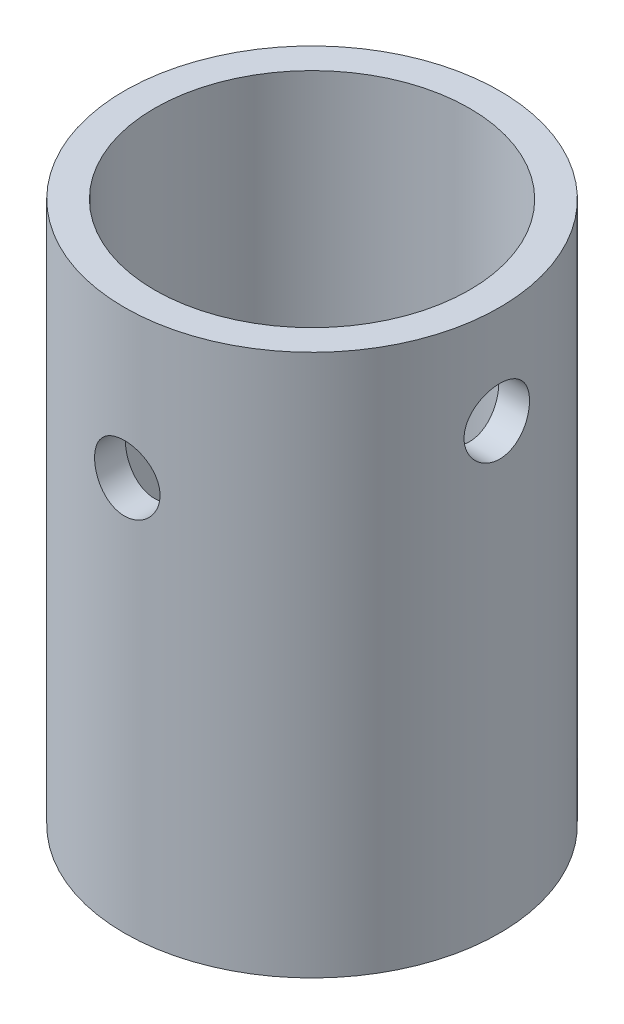
ISO-10303-21;
HEADER;
FILE_DESCRIPTION(('STEP AP214'),'2;1');
FILE_NAME('part.step','',(''),(''),'','','');
FILE_SCHEMA(('AUTOMOTIVE_DESIGN { 1 0 10303 214 1 1 1 1 }'));
ENDSEC;
DATA;
#1=APPLICATION_CONTEXT('core data for automotive mechanical design processes');
#2=APPLICATION_PROTOCOL_DEFINITION('international standard','automotive_design',2000,#1);
#3=PRODUCT_CONTEXT('',#1,'mechanical');
#4=PRODUCT('Part','Part','',(#3));
#5=PRODUCT_RELATED_PRODUCT_CATEGORY('part','',(#4));
#6=PRODUCT_DEFINITION_FORMATION('','',#4);
#7=PRODUCT_DEFINITION_CONTEXT('part definition',#1,'design');
#8=PRODUCT_DEFINITION('design','',#6,#7);
#9=PRODUCT_DEFINITION_SHAPE('','',#8);
#10=(LENGTH_UNIT() NAMED_UNIT(*) SI_UNIT(.MILLI.,.METRE.));
#11=(NAMED_UNIT(*) PLANE_ANGLE_UNIT() SI_UNIT($,.RADIAN.));
#12=(NAMED_UNIT(*) SI_UNIT($,.STERADIAN.) SOLID_ANGLE_UNIT());
#13=UNCERTAINTY_MEASURE_WITH_UNIT(LENGTH_MEASURE(1.E-05),#10,'distance_accuracy_value','');
#14=(GEOMETRIC_REPRESENTATION_CONTEXT(3) GLOBAL_UNCERTAINTY_ASSIGNED_CONTEXT((#13)) GLOBAL_UNIT_ASSIGNED_CONTEXT((#10,
#11,#12)) REPRESENTATION_CONTEXT('',''));
#15=CARTESIAN_POINT('',(0.,0.,0.));
#16=DIRECTION('',(0.,0.,1.));
#17=DIRECTION('',(1.,0.,0.));
#18=AXIS2_PLACEMENT_3D('',#15,#16,#17);
#19=CARTESIAN_POINT('',(0.,-69.7992,0.));
#20=DIRECTION('',(0.,1.,0.));
#21=DIRECTION('',(0.,0.,1.));
#22=AXIS2_PLACEMENT_3D('',#19,#20,#21);
#23=CYLINDRICAL_SURFACE('',#22,24.1681);
#24=CARTESIAN_POINT('',(0.,-23.2664,24.1681));
#25=CARTESIAN_POINT('',(-0.234925923893895,-23.2663907308505,24.1680958752533));
#26=CARTESIAN_POINT('',(-0.469975956286032,-23.2466995477164,24.1646390374497));
#27=CARTESIAN_POINT('',(-0.93347234574665,-23.1684943068735,24.1511820106036));
#28=CARTESIAN_POINT('',(-1.16191262037242,-23.1099456075261,24.1411759830409));
#29=CARTESIAN_POINT('',(-1.60541756222223,-22.9558562706951,24.1157418019555));
#30=CARTESIAN_POINT('',(-1.8204934047821,-22.860347036176,24.1003182523737));
#31=CARTESIAN_POINT('',(-2.23154277134798,-22.6351325740286,24.0657406818646));
#32=CARTESIAN_POINT('',(-2.42751824505791,-22.5054308416779,24.0465870422924));
#33=CARTESIAN_POINT('',(-2.79687340642169,-22.2140746103892,24.0064458097981));
#34=CARTESIAN_POINT('',(-2.97002489988314,-22.0521329270374,23.9854427556224));
#35=CARTESIAN_POINT('',(-3.28684472256177,-21.701511770707,23.9440869000524));
#36=CARTESIAN_POINT('',(-3.43051110131731,-21.5128305302822,23.9237341417508));
#37=CARTESIAN_POINT('',(-3.68520964582988,-21.1125022256914,23.8858334182439));
#38=CARTESIAN_POINT('',(-3.79601380298056,-20.9007080413324,23.868305417995));
#39=CARTESIAN_POINT('',(-3.98038395890463,-20.4611554890087,23.8382545959284));
#40=CARTESIAN_POINT('',(-4.05395272162552,-20.2333983073911,23.8257314026231));
#41=CARTESIAN_POINT('',(-4.16103987268828,-19.7708123661413,23.8072626961096));
#42=CARTESIAN_POINT('',(-4.19495371026622,-19.5360777927726,23.8012522808173));
#43=CARTESIAN_POINT('',(-4.22299491137695,-19.0641789859816,23.7962935761427));
#44=CARTESIAN_POINT('',(-4.21712536036346,-18.8270149424046,23.7973447390901));
#45=CARTESIAN_POINT('',(-4.16608798022823,-18.3598274032389,23.8063312241022));
#46=CARTESIAN_POINT('',(-4.12136632989241,-18.1297534418572,23.8141883829042));
#47=CARTESIAN_POINT('',(-3.99459532860835,-17.6804251244447,23.8357790555914));
#48=CARTESIAN_POINT('',(-3.9125445861867,-17.4611711720767,23.8495127885297));
#49=CARTESIAN_POINT('',(-3.71299796913831,-17.0383818957881,23.8813926178016));
#50=CARTESIAN_POINT('',(-3.59531867035562,-16.8349349287986,23.8995614509841));
#51=CARTESIAN_POINT('',(-3.32798546591173,-16.4505063501412,23.938248807231));
#52=CARTESIAN_POINT('',(-3.17832873880262,-16.2695267230516,23.9587675375584));
#53=CARTESIAN_POINT('',(-2.84886703658209,-15.9325891732341,24.0001851701214));
#54=CARTESIAN_POINT('',(-2.66867966535308,-15.7770050890961,24.021085447138));
#55=CARTESIAN_POINT('',(-2.28455984384187,-15.4982213465603,24.060653797845));
#56=CARTESIAN_POINT('',(-2.0806272121581,-15.3750219355882,24.0793218544802));
#57=CARTESIAN_POINT('',(-1.65444040858053,-15.1644631514793,24.1123527402322));
#58=CARTESIAN_POINT('',(-1.43216853039194,-15.0771389132868,24.1267113451264));
#59=CARTESIAN_POINT('',(-0.975806248901029,-14.941167371624,24.1494720988939));
#60=CARTESIAN_POINT('',(-0.741716932305736,-14.8925165186951,24.1578747943953));
#61=CARTESIAN_POINT('',(-0.27158471239289,-14.8357844370621,24.1677029005805));
#62=CARTESIAN_POINT('',(-0.0356054759680682,-14.8271903667579,24.1692165054259));
#63=CARTESIAN_POINT('',(0.434419832205297,-14.8494455220568,24.1653381894256));
#64=CARTESIAN_POINT('',(0.668465985300905,-14.8802930792974,24.159946560668));
#65=CARTESIAN_POINT('',(1.1263819626363,-14.9801293201566,24.1429182934173));
#66=CARTESIAN_POINT('',(1.3503092777616,-15.0488620812617,24.1313235733923));
#67=CARTESIAN_POINT('',(1.78346252133138,-15.2222433510309,24.1031838333042));
#68=CARTESIAN_POINT('',(1.9926875589182,-15.3268940338191,24.0866385135873));
#69=CARTESIAN_POINT('',(2.39271073582634,-15.5703007722916,24.0502134492878));
#70=CARTESIAN_POINT('',(2.58331264716322,-15.7093746629912,24.0303032126477));
#71=CARTESIAN_POINT('',(2.93865657239103,-16.0172454032818,23.989443625582));
#72=CARTESIAN_POINT('',(3.10339651403665,-16.1860446323818,23.9684941920653));
#73=CARTESIAN_POINT('',(3.40425846191857,-16.5508825939101,23.9276294662301));
#74=CARTESIAN_POINT('',(3.54003267456817,-16.7472100203293,23.9077286922251));
#75=CARTESIAN_POINT('',(3.77667419914949,-17.1601874031636,23.8714930575636));
#76=CARTESIAN_POINT('',(3.87754269158276,-17.3768366719847,23.8551580763199));
#77=CARTESIAN_POINT('',(4.04099901312826,-17.823367770541,23.8280142953103));
#78=CARTESIAN_POINT('',(4.10375499706969,-18.0531865049376,23.817181255819));
#79=CARTESIAN_POINT('',(4.18973050580795,-18.5203096281029,23.8022090048635));
#80=CARTESIAN_POINT('',(4.21295383180433,-18.7576132949348,23.7980691498288));
#81=CARTESIAN_POINT('',(4.21909107796753,-19.2294934468232,23.7969815308347));
#82=CARTESIAN_POINT('',(4.20255282527718,-19.4640627597808,23.7999360216814));
#83=CARTESIAN_POINT('',(4.1308262967662,-19.9270252497369,23.8124890684858));
#84=CARTESIAN_POINT('',(4.07563818204796,-20.1554184524749,23.8220875967497));
#85=CARTESIAN_POINT('',(3.92839620528093,-20.5993036521007,23.846808594638));
#86=CARTESIAN_POINT('',(3.83639391899246,-20.8148132151766,23.861923333591));
#87=CARTESIAN_POINT('',(3.61819268159469,-21.2274265613215,23.8959804009599));
#88=CARTESIAN_POINT('',(3.49199177057268,-21.4245292886294,23.9149229487305));
#89=CARTESIAN_POINT('',(3.20703867583916,-21.7974933669152,23.9548088603261));
#90=CARTESIAN_POINT('',(3.04788497713438,-21.973045561094,23.9757750167925));
#91=CARTESIAN_POINT('',(2.70238783716416,-22.2951371860482,24.0171681412654));
#92=CARTESIAN_POINT('',(2.51603814435421,-22.4416699278173,24.0375949840214));
#93=CARTESIAN_POINT('',(2.1197401069039,-22.702595774972,24.0757897668638));
#94=CARTESIAN_POINT('',(1.90962227371634,-22.8167346611828,24.0935361903173));
#95=CARTESIAN_POINT('',(1.47296386695552,-23.0079159463265,24.1241612021432));
#96=CARTESIAN_POINT('',(1.24643956581896,-23.0849945384049,24.1370445371616));
#97=CARTESIAN_POINT('',(0.849257724732405,-23.1835240183354,24.1537465265391));
#98=CARTESIAN_POINT('',(0.680975360361567,-23.2145515516234,24.1590997280738));
#99=CARTESIAN_POINT('',(0.341817199585527,-23.255992709019,24.1662779302559));
#100=CARTESIAN_POINT('',(0.170941455016608,-23.2664067446022,24.1681030013299));
#101=CARTESIAN_POINT('',(0.,-23.2664,24.1681));
#102=B_SPLINE_CURVE_WITH_KNOTS('',3,(#24,#25,#26,#27,#28,#29,#30,#31,#32,#33,#34,#35,#36,#37,
#38,#39,#40,#41,#42,#43,#44,#45,#46,#47,#48,#49,#50,#51,#52,#53,#54,#55,#56,#57,#58,#59,#60,#61,
#62,#63,#64,#65,#66,#67,#68,#69,#70,#71,#72,#73,#74,#75,#76,#77,#78,#79,#80,#81,#82,#83,#84,#85,
#86,#87,#88,#89,#90,#91,#92,#93,#94,#95,#96,#97,#98,#99,#100,#101),.UNSPECIFIED.,.T.,.F.,(4,2,2,
2,2,2,2,2,2,2,2,2,2,2,2,2,2,2,2,2,2,2,2,2,2,2,2,2,2,2,2,2,2,2,2,2,2,2,4),(0.,0.704152823835044,
1.40893424762859,2.11311817451405,2.81723014513052,3.52791995655473,4.23865676548124,
4.95421534027688,5.66972079205539,6.37802848357429,7.0862812419746,7.78650633847003,
8.48675753858557,9.19067693289189,9.89465846141982,10.6082157707259,11.3217785316002,
12.0360384755243,12.7502328568132,13.4552579180801,14.1602531581014,14.8605433583508,
15.5608759548814,16.267933229024,16.9750471287489,17.6902251742685,18.4053790303056,
19.117354214105,19.8292609352002,20.5314154840261,21.2335671061117,21.9347384557675,
22.6359499978404,23.346269538021,24.0567526173263,24.7726662527244,25.487879298358,
26.000259154431,26.5126287825474),.UNSPECIFIED.);
#103=CARTESIAN_POINT('',(0.,-23.2664,24.1681));
#104=VERTEX_POINT('',#103);
#105=EDGE_CURVE('E60',#104,#104,#102,.T.);
#106=ORIENTED_EDGE('',*,*,#105,.T.);
#107=EDGE_LOOP('',(#106));
#108=FACE_BOUND('',#107,.T.);
#109=CARTESIAN_POINT('',(0.,-69.7992,0.));
#110=DIRECTION('',(0.,1.,0.));
#111=DIRECTION('',(0.,0.,1.));
#112=AXIS2_PLACEMENT_3D('',#109,#110,#111);
#113=CIRCLE('',#112,24.1681);
#114=CARTESIAN_POINT('',(0.,-69.7992,24.1681));
#115=VERTEX_POINT('',#114);
#116=EDGE_CURVE('E10',#115,#115,#113,.T.);
#117=ORIENTED_EDGE('',*,*,#116,.T.);
#118=EDGE_LOOP('',(#117));
#119=FACE_BOUND('',#118,.T.);
#120=CARTESIAN_POINT('',(0.,0.,0.));
#121=DIRECTION('',(0.,1.,0.));
#122=DIRECTION('',(0.,0.,1.));
#123=AXIS2_PLACEMENT_3D('',#120,#121,#122);
#124=CIRCLE('',#123,24.1681);
#125=CARTESIAN_POINT('',(0.,0.,24.1681));
#126=VERTEX_POINT('',#125);
#127=EDGE_CURVE('E44',#126,#126,#124,.T.);
#128=ORIENTED_EDGE('',*,*,#127,.F.);
#129=EDGE_LOOP('',(#128));
#130=FACE_BOUND('',#129,.T.);
#131=CARTESIAN_POINT('',(23.7974584493807,-12.7,4.2164));
#132=CARTESIAN_POINT('',(23.7974628167108,-12.4651047452884,4.21639070567338));
#133=CARTESIAN_POINT('',(23.8009740046235,-12.2300853085014,4.19670448986224));
#134=CARTESIAN_POINT('',(23.8146249020001,-11.7666524630008,4.11852076837192));
#135=CARTESIAN_POINT('',(23.8247705472294,-11.5382451613597,4.05998850692592));
#136=CARTESIAN_POINT('',(23.8505070949223,-11.0948100161082,3.9059472355805));
#137=CARTESIAN_POINT('',(23.8660932576719,-10.8797707179384,3.81047040351858));
#138=CARTESIAN_POINT('',(23.9009490710413,-10.4687828475875,3.58533229978713));
#139=CARTESIAN_POINT('',(23.9202183532129,-10.272832368776,3.4556744469925));
#140=CARTESIAN_POINT('',(23.9605015189554,-9.90345007706144,3.16436299955004));
#141=CARTESIAN_POINT('',(23.9815304593652,-9.73025412023025,3.0024123797057));
#142=CARTESIAN_POINT('',(24.0228300397558,-9.41334816972566,2.65175453808729));
#143=CARTESIAN_POINT('',(24.0431006330267,-9.26963998990188,2.46304567156888));
#144=CARTESIAN_POINT('',(24.080759656399,-9.01489685187362,2.06269207881504));
#145=CARTESIAN_POINT('',(24.0981283026834,-8.90408246379214,1.85090498485126));
#146=CARTESIAN_POINT('',(24.1278585377754,-8.71969145173825,1.41136780029899));
#147=CARTESIAN_POINT('',(24.1402204830527,-8.64611217658744,1.18361884752625));
#148=CARTESIAN_POINT('',(24.1584381444282,-8.53900435303213,0.721062546955468));
#149=CARTESIAN_POINT('',(24.1643582793941,-8.50507900154825,0.486349660120501));
#150=CARTESIAN_POINT('',(24.1692468667927,-8.47700725303012,0.0144936445675548));
#151=CARTESIAN_POINT('',(24.1682158348927,-8.48285790524175,-0.222649302574983));
#152=CARTESIAN_POINT('',(24.1593690160285,-8.53386448579208,-0.689917824960881));
#153=CARTESIAN_POINT('',(24.1516269587482,-8.57859329953441,-0.920091619900941));
#154=CARTESIAN_POINT('',(24.1303103477157,-8.70541289458842,-1.36961586870082));
#155=CARTESIAN_POINT('',(24.1167356032769,-8.78750489741063,-1.5889659684429));
#156=CARTESIAN_POINT('',(24.0851541424752,-8.98713870051097,-2.01187517829616));
#157=CARTESIAN_POINT('',(24.0671257427851,-9.10485459192124,-2.21535042360918));
#158=CARTESIAN_POINT('',(24.0286366706189,-9.37226685202493,-2.59982022133738));
#159=CARTESIAN_POINT('',(24.0081757830349,-9.52196604997583,-2.78081278268295));
#160=CARTESIAN_POINT('',(23.9667730651443,-9.85145902089928,-3.1177056749322));
#161=CARTESIAN_POINT('',(23.9458284568421,-10.0316262468762,-3.27324063505092));
#162=CARTESIAN_POINT('',(23.9060807224102,-10.415687869599,-3.55193470182768));
#163=CARTESIAN_POINT('',(23.8872776198824,-10.619582527799,-3.67509345168149));
#164=CARTESIAN_POINT('',(23.8539394302319,-11.0457567466989,-3.88562246573499));
#165=CARTESIAN_POINT('',(23.8394099867793,-11.2680601256539,-3.97294546585407));
#166=CARTESIAN_POINT('',(23.8163548668859,-11.7244912086278,-4.10890498836676));
#167=CARTESIAN_POINT('',(23.8078286077288,-11.9586177626309,-4.15754526566972));
#168=CARTESIAN_POINT('',(23.7978589371499,-12.4287708651113,-4.21423732042917));
#169=CARTESIAN_POINT('',(23.796324387037,-12.6647325598615,-4.22281140881132));
#170=CARTESIAN_POINT('',(23.8002687217425,-13.134718076387,-4.20052255284243));
#171=CARTESIAN_POINT('',(23.8057473085023,-13.3687419800931,-4.16966128449652));
#172=CARTESIAN_POINT('',(23.8230161647508,-13.8265288419322,-4.06982420363926));
#173=CARTESIAN_POINT('',(23.8347619162302,-14.0503522335913,-4.00111711411091));
#174=CARTESIAN_POINT('',(23.8632039398858,-14.483308907821,-3.82782174706238));
#175=CARTESIAN_POINT('',(23.8799005334318,-14.6924412356728,-3.72323114019688));
#176=CARTESIAN_POINT('',(23.9165732028862,-15.0923953811091,-3.47991603278003));
#177=CARTESIAN_POINT('',(23.9365805983929,-15.2830116941303,-3.34085853693795));
#178=CARTESIAN_POINT('',(23.9775302255626,-15.6383922427651,-3.03301112025422));
#179=CARTESIAN_POINT('',(23.998472529445,-15.8031544767576,-2.86421889949743));
#180=CARTESIAN_POINT('',(24.039222254917,-16.1040730284296,-2.49937253886761));
#181=CARTESIAN_POINT('',(24.0590139234164,-16.2398799449249,-2.3030281892973));
#182=CARTESIAN_POINT('',(24.0949753483986,-16.4765787728786,-1.89000742599939));
#183=CARTESIAN_POINT('',(24.1111452304711,-16.5774718950804,-1.67333171765565));
#184=CARTESIAN_POINT('',(24.1379729675308,-16.7409428492022,-1.22681053518025));
#185=CARTESIAN_POINT('',(24.1486565018362,-16.8036994404303,-0.997032114234335));
#186=CARTESIAN_POINT('',(24.163416726033,-16.8896897923187,-0.529994695015952));
#187=CARTESIAN_POINT('',(24.1674940139451,-16.9129271304097,-0.292736375832544));
#188=CARTESIAN_POINT('',(24.1685726520685,-16.9191085869032,0.179161514199026));
#189=CARTESIAN_POINT('',(24.1656671092918,-16.9025828904236,0.413794094682529));
#190=CARTESIAN_POINT('',(24.1532978447391,-16.8308593531418,0.876886428601377));
#191=CARTESIAN_POINT('',(24.143834168573,-16.7756617812902,1.10534622495499));
#192=CARTESIAN_POINT('',(24.1194093414397,-16.6283721777075,1.54937716958066));
#193=CARTESIAN_POINT('',(24.1044555255588,-16.5363293582153,1.76496507054093));
#194=CARTESIAN_POINT('',(24.0706778668135,-16.318022575343,2.17771841810639));
#195=CARTESIAN_POINT('',(24.0518538125029,-16.1917567421069,2.37488285730995));
#196=CARTESIAN_POINT('',(24.0121224309525,-15.9067281225279,2.7478532144907));
#197=CARTESIAN_POINT('',(23.9911920065713,-15.7475788990031,2.92336138494922));
#198=CARTESIAN_POINT('',(23.9497615683572,-15.4021093569212,3.24536626351324));
#199=CARTESIAN_POINT('',(23.9292616565455,-15.2157826792561,3.39185616281904));
#200=CARTESIAN_POINT('',(23.890838987901,-14.8195072543384,3.65273088633916));
#201=CARTESIAN_POINT('',(23.8729376947463,-14.6093847717123,3.76685501758434));
#202=CARTESIAN_POINT('',(23.8419942435931,-14.1727174763899,3.95800746608893));
#203=CARTESIAN_POINT('',(23.8289473300558,-13.9461889969933,4.03507211002627));
#204=CARTESIAN_POINT('',(23.8120214277692,-13.5490435062725,4.1335660881475));
#205=CARTESIAN_POINT('',(23.806591410147,-13.3808040620689,4.16457776273996));
#206=CARTESIAN_POINT('',(23.7993083700725,-13.04173161982,4.205997881702));
#207=CARTESIAN_POINT('',(23.7974552719178,-12.870898676741,4.21640676211242));
#208=CARTESIAN_POINT('',(23.7974584493807,-12.7,4.2164));
#209=B_SPLINE_CURVE_WITH_KNOTS('',3,(#131,#132,#133,#134,#135,#136,#137,#138,#139,#140,#141,
#142,#143,#144,#145,#146,#147,#148,#149,#150,#151,#152,#153,#154,#155,#156,#157,#158,#159,#160,
#161,#162,#163,#164,#165,#166,#167,#168,#169,#170,#171,#172,#173,#174,#175,#176,#177,#178,#179,
#180,#181,#182,#183,#184,#185,#186,#187,#188,#189,#190,#191,#192,#193,#194,#195,#196,#197,#198,
#199,#200,#201,#202,#203,#204,#205,#206,#207,#208),.UNSPECIFIED.,.T.,.F.,(4,2,2,2,2,2,2,2,2,2,2,
2,2,2,2,2,2,2,2,2,2,2,2,2,2,2,2,2,2,2,2,2,2,2,2,2,2,2,4),(0.,0.704060657728638,1.40875209308055,
2.11283113557599,2.81683978095014,3.52765023437244,4.23850439800824,4.95402278332322,
5.66949021582179,6.37773520151916,7.08592764714699,7.78643685852863,8.48696897322439,
9.1909813851288,9.89505610008788,10.6084862584586,11.3219242789058,12.0363002580273,
12.750606884622,13.4555751944201,14.1605135440175,14.8605098459773,15.5605515961493,
16.2676399904637,16.9747831005332,17.6900287362709,18.4052495661748,19.1170915124438,
19.8288690166833,20.5312086599481,21.2335434187135,21.9349432196118,22.6363813508921,
23.3465863663827,24.0569578263428,24.7728982906881,25.4881355337098,26.0003876075804,
26.5126288399499),.UNSPECIFIED.);
#210=CARTESIAN_POINT('',(23.7974584493807,-12.7,4.2164));
#211=VERTEX_POINT('',#210);
#212=EDGE_CURVE('E61',#211,#211,#209,.T.);
#213=ORIENTED_EDGE('',*,*,#212,.T.);
#214=EDGE_LOOP('',(#213));
#215=FACE_BOUND('',#214,.T.);
#216=ADVANCED_FACE('F31',(#108,#119,#130,#215),#23,.T.);
#217=CARTESIAN_POINT('',(0.,-69.7992,0.));
#218=DIRECTION('',(0.,1.,0.));
#219=DIRECTION('',(0.,0.,1.));
#220=AXIS2_PLACEMENT_3D('',#217,#218,#219);
#221=CYLINDRICAL_SURFACE('',#220,20.2819);
#222=CARTESIAN_POINT('',(0.,-69.7992,0.));
#223=DIRECTION('',(0.,1.,0.));
#224=DIRECTION('',(0.,0.,1.));
#225=AXIS2_PLACEMENT_3D('',#222,#223,#224);
#226=CIRCLE('',#225,20.2819);
#227=CARTESIAN_POINT('',(0.,-69.7992,20.2819));
#228=VERTEX_POINT('',#227);
#229=EDGE_CURVE('E49',#228,#228,#226,.T.);
#230=ORIENTED_EDGE('',*,*,#229,.F.);
#231=EDGE_LOOP('',(#230));
#232=FACE_BOUND('',#231,.T.);
#233=CARTESIAN_POINT('',(0.,0.,0.));
#234=DIRECTION('',(0.,1.,0.));
#235=DIRECTION('',(0.,0.,1.));
#236=AXIS2_PLACEMENT_3D('',#233,#234,#235);
#237=CIRCLE('',#236,20.2819);
#238=CARTESIAN_POINT('',(0.,0.,20.2819));
#239=VERTEX_POINT('',#238);
#240=EDGE_CURVE('E52',#239,#239,#237,.T.);
#241=ORIENTED_EDGE('',*,*,#240,.T.);
#242=EDGE_LOOP('',(#241));
#243=FACE_BOUND('',#242,.T.);
#244=CARTESIAN_POINT('',(0.,-23.2664,20.2819));
#245=CARTESIAN_POINT('',(-0.234136376263136,-23.2663916284441,20.281895666573));
#246=CARTESIAN_POINT('',(-0.468376621434413,-23.2468317602358,20.2778042144398));
#247=CARTESIAN_POINT('',(-0.930222726047517,-23.1691790507416,20.2618774628296));
#248=CARTESIAN_POINT('',(-1.15782339469163,-23.1110568620711,20.2500362655965));
#249=CARTESIAN_POINT('',(-1.5996472445388,-22.9581633999368,20.2199306990559));
#250=CARTESIAN_POINT('',(-1.81388347394976,-22.8634285444361,20.2016727140423));
#251=CARTESIAN_POINT('',(-2.22340888217913,-22.6401102222491,20.1607125086821));
#252=CARTESIAN_POINT('',(-2.41869892430787,-22.5115282988456,20.1380104909765));
#253=CARTESIAN_POINT('',(-2.78764658273533,-22.2221804275278,20.0902860676519));
#254=CARTESIAN_POINT('',(-2.96098836881986,-22.0610160861824,20.0652372298166));
#255=CARTESIAN_POINT('',(-3.27838266041614,-21.7119342044972,20.0158321126651));
#256=CARTESIAN_POINT('',(-3.42243274946759,-21.5240144591046,19.9914758906297));
#257=CARTESIAN_POINT('',(-3.67851911643873,-21.1244582159139,19.9459546210159));
#258=CARTESIAN_POINT('',(-3.7902245817199,-20.9126054793363,19.9248235276752));
#259=CARTESIAN_POINT('',(-3.97633039521455,-20.472625050423,19.8885221531953));
#260=CARTESIAN_POINT('',(-4.05073474437426,-20.2444991065638,19.8733512328011));
#261=CARTESIAN_POINT('',(-4.15909331922711,-19.7818576741955,19.8509561035535));
#262=CARTESIAN_POINT('',(-4.19360378274942,-19.5474778605611,19.8436227282144));
#263=CARTESIAN_POINT('',(-4.22292344668596,-19.0761491430278,19.837404726131));
#264=CARTESIAN_POINT('',(-4.21773704144648,-18.8392005263889,19.8385191642343));
#265=CARTESIAN_POINT('',(-4.16825905133726,-18.3735566277836,19.8489718266951));
#266=CARTESIAN_POINT('',(-4.12460858954747,-18.1447897407932,19.8581752170565));
#267=CARTESIAN_POINT('',(-4.00045508882072,-17.6978985697517,19.8835561337505));
#268=CARTESIAN_POINT('',(-3.9199501627713,-17.47977483131,19.8997340172058));
#269=CARTESIAN_POINT('',(-3.72377049657347,-17.058532701789,19.9373768807016));
#270=CARTESIAN_POINT('',(-3.60784477178097,-16.8555346902013,19.958879376766));
#271=CARTESIAN_POINT('',(-3.34429104524439,-16.4716335062348,20.0047250406985));
#272=CARTESIAN_POINT('',(-3.19665912005989,-16.2907330726406,20.0290685599547));
#273=CARTESIAN_POINT('',(-2.87046702613451,-15.9524660598403,20.0784352077166));
#274=CARTESIAN_POINT('',(-2.6913604837189,-15.795626461333,20.1034623382896));
#275=CARTESIAN_POINT('',(-2.30911073436506,-15.5141302855035,20.1509431106859));
#276=CARTESIAN_POINT('',(-2.10596716978364,-15.3894741871225,20.1733967142084));
#277=CARTESIAN_POINT('',(-1.68080076743778,-15.1757726932771,20.2132627040941));
#278=CARTESIAN_POINT('',(-1.4587449307295,-15.0867911542499,20.2306660353773));
#279=CARTESIAN_POINT('',(-1.00239268345594,-14.94754597847,20.258402515399));
#280=CARTESIAN_POINT('',(-0.768097881679276,-14.8972772665971,20.2687365908731));
#281=CARTESIAN_POINT('',(-0.298443597853821,-14.8376391438674,20.2810399555281));
#282=CARTESIAN_POINT('',(-0.0631793688537663,-14.8275491034669,20.2831566117208));
#283=CARTESIAN_POINT('',(0.405673083383123,-14.8466088676165,20.2791974680948));
#284=CARTESIAN_POINT('',(0.639261407913451,-14.87575628018,20.2731221676726));
#285=CARTESIAN_POINT('',(1.09578068367622,-14.9718652856029,20.2535542762445));
#286=CARTESIAN_POINT('',(1.31879360525223,-15.0384537406472,20.2401349109459));
#287=CARTESIAN_POINT('',(1.75048723384684,-15.2071442469402,20.2073790495796));
#288=CARTESIAN_POINT('',(1.95916680277468,-15.3092491143535,20.1880420843087));
#289=CARTESIAN_POINT('',(2.35928493568719,-15.5476093268159,20.1452301992317));
#290=CARTESIAN_POINT('',(2.55046205048025,-15.6842942166641,20.1217044257391));
#291=CARTESIAN_POINT('',(2.90742478057433,-15.9873632922871,20.0732373183121));
#292=CARTESIAN_POINT('',(3.07320743402976,-16.1537509375058,20.0482958197209));
#293=CARTESIAN_POINT('',(3.37748460024892,-16.5147941203781,19.9993064927861));
#294=CARTESIAN_POINT('',(3.51548257418686,-16.7098715785841,19.9752802606198));
#295=CARTESIAN_POINT('',(3.75675635168782,-17.1208595325184,19.9313158293416));
#296=CARTESIAN_POINT('',(3.86003359812919,-17.3367691620507,19.9113774603651));
#297=CARTESIAN_POINT('',(4.02827398692207,-17.7821704447173,19.8780240625507));
#298=CARTESIAN_POINT('',(4.09344353450609,-18.0115813794608,19.8645739616509));
#299=CARTESIAN_POINT('',(4.18423649912767,-18.4784095815309,19.8456499572536));
#300=CARTESIAN_POINT('',(4.20986554580786,-18.7158257041863,19.8401749182998));
#301=CARTESIAN_POINT('',(4.2206286555369,-19.1869311987302,19.8378875139127));
#302=CARTESIAN_POINT('',(4.20654837286584,-19.4206021545637,19.8409070786737));
#303=CARTESIAN_POINT('',(4.14003569096271,-19.882165614169,19.8548912512376));
#304=CARTESIAN_POINT('',(4.08760365649412,-20.1100581728778,19.8658557834759));
#305=CARTESIAN_POINT('',(3.94623846516954,-20.5530448251113,19.8944164931829));
#306=CARTESIAN_POINT('',(3.85740906895257,-20.7681733264278,19.9119938075435));
#307=CARTESIAN_POINT('',(3.64586401785078,-21.1805938563571,19.951808864524));
#308=CARTESIAN_POINT('',(3.52314523346275,-21.3778842354805,19.9740470375034));
#309=CARTESIAN_POINT('',(3.24465342243168,-21.7529243609075,20.0211873828919));
#310=CARTESIAN_POINT('',(3.08831604295118,-21.9302499205966,20.0461308952539));
#311=CARTESIAN_POINT('',(2.74818145591327,-22.2564086691339,20.0955826625723));
#312=CARTESIAN_POINT('',(2.56437793583138,-22.405235290104,20.1200908160179));
#313=CARTESIAN_POINT('',(2.17199085601632,-22.6717937317589,20.1662429121332));
#314=CARTESIAN_POINT('',(1.96314717621133,-22.789149190504,20.1878507655975));
#315=CARTESIAN_POINT('',(1.52830435532236,-22.9869098363784,20.2254098920452));
#316=CARTESIAN_POINT('',(1.3023204418319,-23.0673473839855,20.2413661161652));
#317=CARTESIAN_POINT('',(0.896617320779008,-23.1739178279486,20.2628275298853));
#318=CARTESIAN_POINT('',(0.719162547884224,-23.208535054416,20.2699368563611));
#319=CARTESIAN_POINT('',(0.361159043003745,-23.254778947848,20.2794746769908));
#320=CARTESIAN_POINT('',(0.18061042469909,-23.2664064577333,20.2819033427616));
#321=CARTESIAN_POINT('',(0.,-23.2664,20.2819));
#322=B_SPLINE_CURVE_WITH_KNOTS('',3,(#244,#245,#246,#247,#248,#249,#250,#251,#252,#253,#254,
#255,#256,#257,#258,#259,#260,#261,#262,#263,#264,#265,#266,#267,#268,#269,#270,#271,#272,#273,
#274,#275,#276,#277,#278,#279,#280,#281,#282,#283,#284,#285,#286,#287,#288,#289,#290,#291,#292,
#293,#294,#295,#296,#297,#298,#299,#300,#301,#302,#303,#304,#305,#306,#307,#308,#309,#310,#311,
#312,#313,#314,#315,#316,#317,#318,#319,#320,#321),.UNSPECIFIED.,.T.,.F.,(4,2,2,2,2,2,2,2,2,2,2,
2,2,2,2,2,2,2,2,2,2,2,2,2,2,2,2,2,2,2,2,2,2,2,2,2,2,2,4),(0.,0.701748248084917,1.40403116666496,
2.10561732746723,2.80717150445545,3.51788801469094,4.22866313273236,4.94646998192219,
5.66419982211913,6.37179688144874,7.07931561264716,7.77525980214365,8.47123963106414,
9.17227012457516,9.87338741618016,10.5881600620319,11.3029433442144,12.0190004161233,
12.7349635993922,13.4380260892789,14.1410457211365,14.8371801647534,15.5333698187957,
16.2386728281219,16.9440580368928,17.6611068634911,18.3781258882323,19.0912244149162,
19.8042214036743,20.503211183028,21.202194314377,21.8991985154146,22.5962671025869,
23.306105651685,24.0161075941278,24.7342558268403,25.4517733571918,25.9931146833308,
26.534436160759),.UNSPECIFIED.);
#323=CARTESIAN_POINT('',(0.,-23.2664,20.2819));
#324=VERTEX_POINT('',#323);
#325=EDGE_CURVE('E54',#324,#324,#322,.T.);
#326=ORIENTED_EDGE('',*,*,#325,.F.);
#327=EDGE_LOOP('',(#326));
#328=FACE_BOUND('',#327,.T.);
#329=CARTESIAN_POINT('',(19.8387862191718,-12.7,4.2164));
#330=CARTESIAN_POINT('',(19.8387909228125,-12.4659252539646,4.21639158236567));
#331=CARTESIAN_POINT('',(19.8429740114051,-12.2317465195646,4.19684166101222));
#332=CARTESIAN_POINT('',(19.8592272949228,-11.7700281181948,4.11923203885373));
#333=CARTESIAN_POINT('',(19.8713035498922,-11.5424936927833,4.06114274861153));
#334=CARTESIAN_POINT('',(19.9019176954311,-11.1008101660776,3.90834545957166));
#335=CARTESIAN_POINT('',(19.9204488854223,-10.8866474550139,3.81367542250947));
#336=CARTESIAN_POINT('',(19.9618768987236,-10.4772460871335,3.59050991415249));
#337=CARTESIAN_POINT('',(19.9847735419539,-10.2820066502113,3.46201583805451));
#338=CARTESIAN_POINT('',(20.0327432002612,-9.91300542459443,3.1727582054818));
#339=CARTESIAN_POINT('',(20.0578417425737,-9.73957466987854,3.01157651804445));
#340=CARTESIAN_POINT('',(20.1071630476361,-9.42200764742614,2.66242212990906));
#341=CARTESIAN_POINT('',(20.1313857462032,-9.27787352301626,2.47444747076105));
#342=CARTESIAN_POINT('',(20.1765025654903,-9.02169635303464,2.0748395795639));
#343=CARTESIAN_POINT('',(20.1973630650487,-8.90996946685252,1.86299954492484));
#344=CARTESIAN_POINT('',(20.2331176576328,-8.72382059236288,1.42304655925061));
#345=CARTESIAN_POINT('',(20.2480123545309,-8.64939482815835,1.19493525798557));
#346=CARTESIAN_POINT('',(20.2699767488465,-8.54099578001363,0.732353259587224));
#347=CARTESIAN_POINT('',(20.2771545804245,-8.5064629613471,0.498018901323336));
#348=CARTESIAN_POINT('',(20.2832504505686,-8.47708281641857,0.0267802673649214));
#349=CARTESIAN_POINT('',(20.2821693463349,-8.48223137160186,-0.210123739075557));
#350=CARTESIAN_POINT('',(20.2719524745874,-8.53164658392724,-0.675926884532245));
#351=CARTESIAN_POINT('',(20.2629408464586,-8.57531037254778,-0.904893100353767));
#352=CARTESIAN_POINT('',(20.2380160545282,-8.69955853391718,-1.35217591798531));
#353=CARTESIAN_POINT('',(20.2221025992795,-8.78014446580483,-1.57049206963634));
#354=CARTESIAN_POINT('',(20.1849596237054,-8.97649745294396,-1.99197836371067));
#355=CARTESIAN_POINT('',(20.1636950607468,-9.09249753550457,-2.19503673394516));
#356=CARTESIAN_POINT('',(20.1181889472662,-9.3562130437117,-2.57902770131821));
#357=CARTESIAN_POINT('',(20.0939470282725,-9.50393239656856,-2.75995755433416));
#358=CARTESIAN_POINT('',(20.0446206463885,-9.83019032325994,-3.09813663996841));
#359=CARTESIAN_POINT('',(20.0195289130021,-10.0092565491372,-3.25487617319748));
#360=CARTESIAN_POINT('',(19.9717614180332,-10.3913887214967,-3.53618914308146));
#361=CARTESIAN_POINT('',(19.9490857098148,-10.594455197878,-3.66076186933521));
#362=CARTESIAN_POINT('',(19.9087012815463,-11.0195932467882,-3.87440149661016));
#363=CARTESIAN_POINT('',(19.8910049268295,-11.2417103760128,-3.96338023316678));
#364=CARTESIAN_POINT('',(19.8627598124777,-11.6981968964642,-4.10260139446327));
#365=CARTESIAN_POINT('',(19.8522100390966,-11.9325645448662,-4.15284931332821));
#366=CARTESIAN_POINT('',(19.8396572033649,-12.4022641375338,-4.2124089126478));
#367=CARTESIAN_POINT('',(19.8374999644794,-12.6374984158699,-4.22245914970595));
#368=CARTESIAN_POINT('',(19.8415617605924,-13.1062817209229,-4.20333049033985));
#369=CARTESIAN_POINT('',(19.8477802797166,-13.3398308505399,-4.17415400994248));
#370=CARTESIAN_POINT('',(19.8677480379212,-13.7960952993423,-4.0780385489154));
#371=CARTESIAN_POINT('',(19.8814175428872,-14.0188986061405,-4.01149917084514));
#372=CARTESIAN_POINT('',(19.9146763241585,-14.4501944873729,-3.84297620472937));
#373=CARTESIAN_POINT('',(19.9342661211213,-14.6586858011655,-3.74098949916634));
#374=CARTESIAN_POINT('',(19.9775014420136,-15.0586565098407,-3.50281348935091));
#375=CARTESIAN_POINT('',(20.001199944724,-15.2498566246229,-3.3661649966446));
#376=CARTESIAN_POINT('',(20.049839441614,-15.6068824493143,-3.06315180388119));
#377=CARTESIAN_POINT('',(20.0747805742574,-15.7727053230661,-2.89678378687019));
#378=CARTESIAN_POINT('',(20.1235987129136,-16.0770970544169,-2.53572760834359));
#379=CARTESIAN_POINT('',(20.1474510094113,-16.2151648214859,-2.34061310559319));
#380=CARTESIAN_POINT('',(20.190964307957,-16.4565609500518,-1.92952976606384));
#381=CARTESIAN_POINT('',(20.2106254947077,-16.5598908425667,-1.71356184890694));
#382=CARTESIAN_POINT('',(20.2434363101584,-16.7281609893903,-1.26817528064294));
#383=CARTESIAN_POINT('',(20.2566246728839,-16.7933300666598,-1.03884606189154));
#384=CARTESIAN_POINT('',(20.275170567723,-16.8841496713694,-0.572192432626471));
#385=CARTESIAN_POINT('',(20.280529122769,-16.9098053610956,-0.334869070660309));
#386=CARTESIAN_POINT('',(20.2827849056568,-16.9206567104974,0.136262096941754));
#387=CARTESIAN_POINT('',(20.2798392285216,-16.9066035493319,0.370052170438829));
#388=CARTESIAN_POINT('',(20.2661503982223,-16.8401035984169,0.831861149969924));
#389=CARTESIAN_POINT('',(20.2554073597523,-16.7876573734045,1.05988014084177));
#390=CARTESIAN_POINT('',(20.2273383164632,-16.6462049051059,1.50315966695033));
#391=CARTESIAN_POINT('',(20.2100297854634,-16.5572956562771,1.71845232996044));
#392=CARTESIAN_POINT('',(20.1706870112859,-16.3455394343345,2.13116861830456));
#393=CARTESIAN_POINT('',(20.1486523586943,-16.2226895207472,2.32859069343919));
#394=CARTESIAN_POINT('',(20.1017933378672,-15.9440399744492,2.70365570908648));
#395=CARTESIAN_POINT('',(20.0769272706291,-15.7877066309326,2.88089696826838));
#396=CARTESIAN_POINT('',(20.0274459390908,-15.4476164890037,3.20688751614058));
#397=CARTESIAN_POINT('',(20.0028307359793,-15.2638531633893,3.35563000401088));
#398=CARTESIAN_POINT('',(19.9563162020669,-14.8715109783004,3.62208095328073));
#399=CARTESIAN_POINT('',(19.9344524046247,-14.6626645185558,3.7394018878118));
#400=CARTESIAN_POINT('',(19.8963551593474,-14.227819243697,3.9370972549268));
#401=CARTESIAN_POINT('',(19.8801167466348,-14.0018357693038,4.01750428764188));
#402=CARTESIAN_POINT('',(19.8582527326152,-13.5962103606991,4.12400232753987));
#403=CARTESIAN_POINT('',(19.8509993314229,-13.4188374077923,4.1585876581342));
#404=CARTESIAN_POINT('',(19.8412643561348,-13.0609968388497,4.20478928183473));
#405=CARTESIAN_POINT('',(19.8387825915049,-12.8805293466711,4.21640649207167));
#406=CARTESIAN_POINT('',(19.8387862191718,-12.7,4.2164));
#407=B_SPLINE_CURVE_WITH_KNOTS('',3,(#329,#330,#331,#332,#333,#334,#335,#336,#337,#338,#339,
#340,#341,#342,#343,#344,#345,#346,#347,#348,#349,#350,#351,#352,#353,#354,#355,#356,#357,#358,
#359,#360,#361,#362,#363,#364,#365,#366,#367,#368,#369,#370,#371,#372,#373,#374,#375,#376,#377,
#378,#379,#380,#381,#382,#383,#384,#385,#386,#387,#388,#389,#390,#391,#392,#393,#394,#395,#396,
#397,#398,#399,#400,#401,#402,#403,#404,#405,#406),.UNSPECIFIED.,.T.,.F.,(4,2,2,2,2,2,2,2,2,2,2,
2,2,2,2,2,2,2,2,2,2,2,2,2,2,2,2,2,2,2,2,2,2,2,2,2,2,2,4),(0.,0.701562985628069,1.40366523577132,
2.10504082641699,2.80638749078094,3.51734641355734,4.22835733102227,4.94608785626603,
5.66374571280538,6.3712106429487,7.07860214585148,7.77511371076142,8.47165469049411,
9.17288151813094,9.87419521582332,10.5887063983426,11.3032333594305,12.0195193678396,
12.7357037494367,13.4386674277115,14.1415878114806,14.8371297365968,15.5327328486401,
16.2380819818141,16.9435098872434,17.6607120304242,18.3778825598877,19.0907074917108,
19.8034392875419,20.5027789738851,21.2021083736045,21.8995894463147,22.5971309647497,
23.3067508510761,24.0165398675953,24.7347170188021,25.4522586933719,25.9933583515432,
26.534436402846),.UNSPECIFIED.);
#408=CARTESIAN_POINT('',(19.8387862191718,-12.7,4.2164));
#409=VERTEX_POINT('',#408);
#410=EDGE_CURVE('E35',#409,#409,#407,.T.);
#411=ORIENTED_EDGE('',*,*,#410,.F.);
#412=EDGE_LOOP('',(#411));
#413=FACE_BOUND('',#412,.T.);
#414=ADVANCED_FACE('F62',(#232,#243,#328,#413),#221,.F.);
#415=CARTESIAN_POINT('',(0.,-69.7992,0.));
#416=DIRECTION('',(0.,1.,0.));
#417=DIRECTION('',(0.,0.,1.));
#418=AXIS2_PLACEMENT_3D('',#415,#416,#417);
#419=PLANE('',#418);
#420=ORIENTED_EDGE('',*,*,#229,.T.);
#421=EDGE_LOOP('',(#420));
#422=FACE_BOUND('',#421,.T.);
#423=ORIENTED_EDGE('',*,*,#116,.F.);
#424=EDGE_LOOP('',(#423));
#425=FACE_BOUND('',#424,.T.);
#426=ADVANCED_FACE('F92',(#422,#425),#419,.F.);
#427=CARTESIAN_POINT('',(0.,0.,0.));
#428=DIRECTION('',(0.,1.,0.));
#429=DIRECTION('',(0.,0.,1.));
#430=AXIS2_PLACEMENT_3D('',#427,#428,#429);
#431=PLANE('',#430);
#432=ORIENTED_EDGE('',*,*,#240,.F.);
#433=EDGE_LOOP('',(#432));
#434=FACE_BOUND('',#433,.T.);
#435=ORIENTED_EDGE('',*,*,#127,.T.);
#436=EDGE_LOOP('',(#435));
#437=FACE_BOUND('',#436,.T.);
#438=ADVANCED_FACE('F69',(#434,#437),#431,.T.);
#439=CARTESIAN_POINT('',(0.,-19.05,69.7992));
#440=DIRECTION('',(0.,0.,-1.));
#441=DIRECTION('',(-1.,0.,0.));
#442=AXIS2_PLACEMENT_3D('',#439,#440,#441);
#443=CYLINDRICAL_SURFACE('',#442,4.2164);
#444=ORIENTED_EDGE('',*,*,#105,.F.);
#445=EDGE_LOOP('',(#444));
#446=FACE_BOUND('',#445,.T.);
#447=ORIENTED_EDGE('',*,*,#325,.T.);
#448=EDGE_LOOP('',(#447));
#449=FACE_BOUND('',#448,.T.);
#450=ADVANCED_FACE('F65',(#446,#449),#443,.F.);
#451=CARTESIAN_POINT('',(69.7992,-12.7,0.));
#452=DIRECTION('',(-1.,0.,0.));
#453=DIRECTION('',(0.,0.,1.));
#454=AXIS2_PLACEMENT_3D('',#451,#452,#453);
#455=CYLINDRICAL_SURFACE('',#454,4.2164);
#456=ORIENTED_EDGE('',*,*,#212,.F.);
#457=EDGE_LOOP('',(#456));
#458=FACE_BOUND('',#457,.T.);
#459=ORIENTED_EDGE('',*,*,#410,.T.);
#460=EDGE_LOOP('',(#459));
#461=FACE_BOUND('',#460,.T.);
#462=ADVANCED_FACE('F68',(#458,#461),#455,.F.);
#463=CLOSED_SHELL('',(#216,#414,#426,#438,#450,#462));
#464=MANIFOLD_SOLID_BREP('B2',#463);
#465=ADVANCED_BREP_SHAPE_REPRESENTATION('',(#18,#464),#14);
#466=SHAPE_DEFINITION_REPRESENTATION(#9,#465);
ENDSEC;
END-ISO-10303-21;
